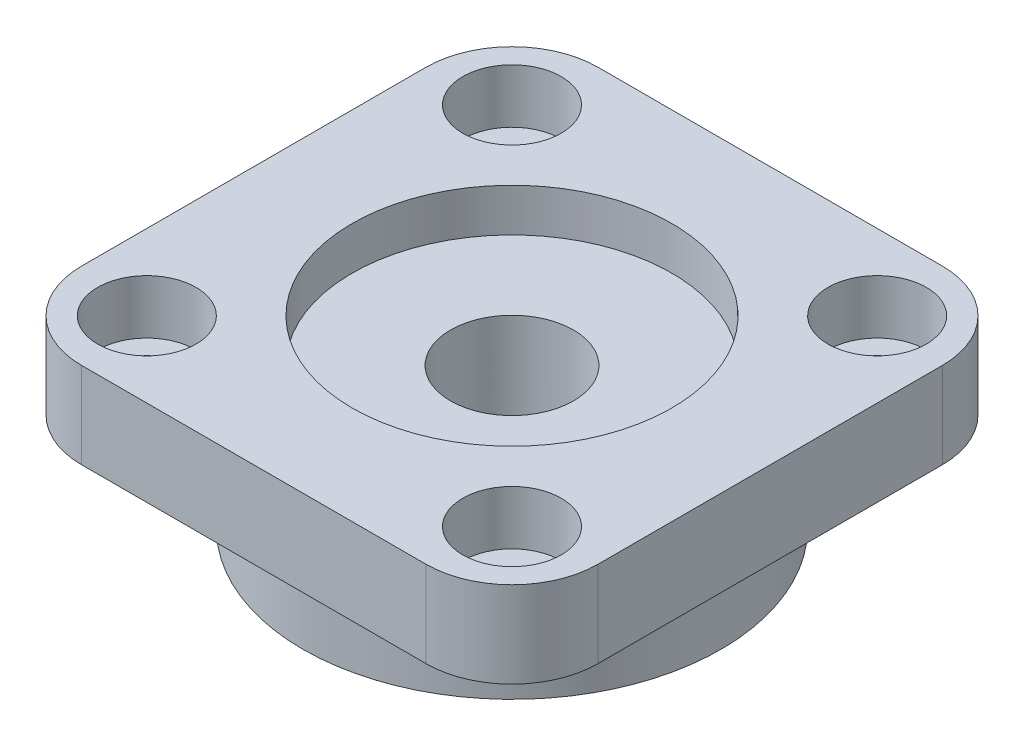
ISO-10303-21;
HEADER;
FILE_DESCRIPTION(('STEP AP214'),'2;1');
FILE_NAME('part.step','',(''),(''),'','','');
FILE_SCHEMA(('AUTOMOTIVE_DESIGN { 1 0 10303 214 1 1 1 1 }'));
ENDSEC;
DATA;
#1=APPLICATION_CONTEXT('core data for automotive mechanical design processes');
#2=APPLICATION_PROTOCOL_DEFINITION('international standard','automotive_design',2000,#1);
#3=PRODUCT_CONTEXT('',#1,'mechanical');
#4=PRODUCT('Part','Part','',(#3));
#5=PRODUCT_RELATED_PRODUCT_CATEGORY('part','',(#4));
#6=PRODUCT_DEFINITION_FORMATION('','',#4);
#7=PRODUCT_DEFINITION_CONTEXT('part definition',#1,'design');
#8=PRODUCT_DEFINITION('design','',#6,#7);
#9=PRODUCT_DEFINITION_SHAPE('','',#8);
#10=(LENGTH_UNIT() NAMED_UNIT(*) SI_UNIT(.MILLI.,.METRE.));
#11=(NAMED_UNIT(*) PLANE_ANGLE_UNIT() SI_UNIT($,.RADIAN.));
#12=(NAMED_UNIT(*) SI_UNIT($,.STERADIAN.) SOLID_ANGLE_UNIT());
#13=UNCERTAINTY_MEASURE_WITH_UNIT(LENGTH_MEASURE(1.E-05),#10,'distance_accuracy_value','');
#14=(GEOMETRIC_REPRESENTATION_CONTEXT(3) GLOBAL_UNCERTAINTY_ASSIGNED_CONTEXT((#13)) GLOBAL_UNIT_ASSIGNED_CONTEXT((#10,
#11,#12)) REPRESENTATION_CONTEXT('',''));
#15=CARTESIAN_POINT('',(0.,0.,0.));
#16=DIRECTION('',(0.,0.,1.));
#17=DIRECTION('',(1.,0.,0.));
#18=AXIS2_PLACEMENT_3D('',#15,#16,#17);
#19=CARTESIAN_POINT('',(0.,8.,0.));
#20=DIRECTION('',(0.,-1.,0.));
#21=DIRECTION('',(0.,0.,-1.));
#22=AXIS2_PLACEMENT_3D('',#19,#20,#21);
#23=CYLINDRICAL_SURFACE('',#22,5.);
#24=CARTESIAN_POINT('',(0.,3.5,0.));
#25=DIRECTION('',(0.,-1.,0.));
#26=DIRECTION('',(0.,0.,-1.));
#27=AXIS2_PLACEMENT_3D('',#24,#25,#26);
#28=CIRCLE('',#27,5.);
#29=CARTESIAN_POINT('',(0.,3.5,-5.));
#30=VERTEX_POINT('',#29);
#31=EDGE_CURVE('E187',#30,#30,#28,.T.);
#32=ORIENTED_EDGE('',*,*,#31,.T.);
#33=EDGE_LOOP('',(#32));
#34=FACE_BOUND('',#33,.T.);
#35=CARTESIAN_POINT('',(0.,11.5,0.));
#36=DIRECTION('',(0.,1.,0.));
#37=DIRECTION('',(0.,0.,1.));
#38=AXIS2_PLACEMENT_3D('',#35,#36,#37);
#39=CIRCLE('',#38,5.);
#40=CARTESIAN_POINT('',(0.,11.5,5.));
#41=VERTEX_POINT('',#40);
#42=EDGE_CURVE('E39',#41,#41,#39,.T.);
#43=ORIENTED_EDGE('',*,*,#42,.T.);
#44=EDGE_LOOP('',(#43));
#45=FACE_BOUND('',#44,.T.);
#46=ADVANCED_FACE('F35',(#34,#45),#23,.F.);
#47=CARTESIAN_POINT('',(0.,0.,0.));
#48=DIRECTION('',(0.,1.,0.));
#49=DIRECTION('',(0.,0.,1.));
#50=AXIS2_PLACEMENT_3D('',#47,#48,#49);
#51=PLANE('',#50);
#52=CARTESIAN_POINT('',(0.,0.,0.));
#53=DIRECTION('',(0.,-1.,0.));
#54=DIRECTION('',(0.,0.,-1.));
#55=AXIS2_PLACEMENT_3D('',#52,#53,#54);
#56=CIRCLE('',#55,13.);
#57=CARTESIAN_POINT('',(0.,0.,-13.));
#58=VERTEX_POINT('',#57);
#59=EDGE_CURVE('E197',#58,#58,#56,.T.);
#60=ORIENTED_EDGE('',*,*,#59,.F.);
#61=EDGE_LOOP('',(#60));
#62=FACE_BOUND('',#61,.T.);
#63=CARTESIAN_POINT('',(0.,0.,0.));
#64=DIRECTION('',(0.,1.,0.));
#65=DIRECTION('',(0.,0.,1.));
#66=AXIS2_PLACEMENT_3D('',#63,#64,#65);
#67=CIRCLE('',#66,17.);
#68=CARTESIAN_POINT('',(0.,0.,17.));
#69=VERTEX_POINT('',#68);
#70=EDGE_CURVE('E145',#69,#69,#67,.T.);
#71=ORIENTED_EDGE('',*,*,#70,.F.);
#72=EDGE_LOOP('',(#71));
#73=FACE_BOUND('',#72,.T.);
#74=ADVANCED_FACE('F264',(#62,#73),#51,.F.);
#75=CARTESIAN_POINT('',(0.,8.,0.));
#76=DIRECTION('',(0.,-1.,0.));
#77=DIRECTION('',(0.,0.,-1.));
#78=AXIS2_PLACEMENT_3D('',#75,#76,#77);
#79=CYLINDRICAL_SURFACE('',#78,17.);
#80=CARTESIAN_POINT('',(0.,8.,0.));
#81=DIRECTION('',(0.,1.,0.));
#82=DIRECTION('',(0.,0.,1.));
#83=AXIS2_PLACEMENT_3D('',#80,#81,#82);
#84=CIRCLE('',#83,17.);
#85=CARTESIAN_POINT('',(0.,8.,17.));
#86=VERTEX_POINT('',#85);
#87=EDGE_CURVE('E142',#86,#86,#84,.T.);
#88=ORIENTED_EDGE('',*,*,#87,.F.);
#89=EDGE_LOOP('',(#88));
#90=FACE_BOUND('',#89,.T.);
#91=ORIENTED_EDGE('',*,*,#70,.T.);
#92=EDGE_LOOP('',(#91));
#93=FACE_BOUND('',#92,.T.);
#94=ADVANCED_FACE('F269',(#90,#93),#79,.T.);
#95=CARTESIAN_POINT('',(0.,8.,0.));
#96=DIRECTION('',(0.,1.,0.));
#97=DIRECTION('',(0.,0.,1.));
#98=AXIS2_PLACEMENT_3D('',#95,#96,#97);
#99=PLANE('',#98);
#100=CARTESIAN_POINT('',(-14.8492424049175,8.,-14.8492424049167));
#101=DIRECTION('',(0.,1.,0.));
#102=DIRECTION('',(0.,0.,1.));
#103=AXIS2_PLACEMENT_3D('',#100,#101,#102);
#104=CIRCLE('',#103,2.25);
#105=CARTESIAN_POINT('',(-14.8492424049175,8.,-12.5992424049167));
#106=VERTEX_POINT('',#105);
#107=EDGE_CURVE('E183',#106,#106,#104,.T.);
#108=ORIENTED_EDGE('',*,*,#107,.T.);
#109=EDGE_LOOP('',(#108));
#110=FACE_BOUND('',#109,.T.);
#111=CARTESIAN_POINT('',(14.8492424049175,8.,-14.8492424049175));
#112=DIRECTION('',(0.,1.,0.));
#113=DIRECTION('',(0.,0.,1.));
#114=AXIS2_PLACEMENT_3D('',#111,#112,#113);
#115=CIRCLE('',#114,2.25);
#116=CARTESIAN_POINT('',(14.8492424049175,8.,-12.5992424049175));
#117=VERTEX_POINT('',#116);
#118=EDGE_CURVE('E178',#117,#117,#115,.T.);
#119=ORIENTED_EDGE('',*,*,#118,.T.);
#120=EDGE_LOOP('',(#119));
#121=FACE_BOUND('',#120,.T.);
#122=CARTESIAN_POINT('',(14.8492424049183,8.,14.8492424049175));
#123=DIRECTION('',(0.,1.,0.));
#124=DIRECTION('',(0.,0.,1.));
#125=AXIS2_PLACEMENT_3D('',#122,#123,#124);
#126=CIRCLE('',#125,2.25);
#127=CARTESIAN_POINT('',(14.8492424049183,8.,17.0992424049175));
#128=VERTEX_POINT('',#127);
#129=EDGE_CURVE('E173',#128,#128,#126,.T.);
#130=ORIENTED_EDGE('',*,*,#129,.T.);
#131=EDGE_LOOP('',(#130));
#132=FACE_BOUND('',#131,.T.);
#133=CARTESIAN_POINT('',(-14.8492424049167,8.,14.8492424049183));
#134=DIRECTION('',(0.,1.,0.));
#135=DIRECTION('',(0.,0.,1.));
#136=AXIS2_PLACEMENT_3D('',#133,#134,#135);
#137=CIRCLE('',#136,2.25);
#138=CARTESIAN_POINT('',(-14.8492424049167,8.,17.0992424049183));
#139=VERTEX_POINT('',#138);
#140=EDGE_CURVE('E136',#139,#139,#137,.T.);
#141=ORIENTED_EDGE('',*,*,#140,.T.);
#142=EDGE_LOOP('',(#141));
#143=FACE_BOUND('',#142,.T.);
#144=DIRECTION('',(1.,0.,0.));
#145=VECTOR('',#144,1.);
#146=CARTESIAN_POINT('',(21.,8.,21.));
#147=LINE('',#146,#145);
#148=CARTESIAN_POINT('',(-14.,8.,21.));
#149=VERTEX_POINT('',#148);
#150=CARTESIAN_POINT('',(14.,8.,21.));
#151=VERTEX_POINT('',#150);
#152=EDGE_CURVE('E120',#149,#151,#147,.T.);
#153=ORIENTED_EDGE('',*,*,#152,.F.);
#154=CARTESIAN_POINT('',(-14.,8.,14.));
#155=DIRECTION('',(0.,1.,0.));
#156=DIRECTION('',(0.,0.,1.));
#157=AXIS2_PLACEMENT_3D('',#154,#155,#156);
#158=CIRCLE('',#157,7.);
#159=CARTESIAN_POINT('',(-21.,8.,14.));
#160=VERTEX_POINT('',#159);
#161=EDGE_CURVE('E103',#149,#160,#158,.F.);
#162=ORIENTED_EDGE('',*,*,#161,.T.);
#163=DIRECTION('',(0.,0.,1.));
#164=VECTOR('',#163,1.);
#165=CARTESIAN_POINT('',(-21.,8.,21.));
#166=LINE('',#165,#164);
#167=CARTESIAN_POINT('',(-21.,8.,-14.));
#168=VERTEX_POINT('',#167);
#169=EDGE_CURVE('E131',#168,#160,#166,.T.);
#170=ORIENTED_EDGE('',*,*,#169,.F.);
#171=CARTESIAN_POINT('',(-14.,8.,-14.));
#172=DIRECTION('',(0.,1.,0.));
#173=DIRECTION('',(0.,0.,1.));
#174=AXIS2_PLACEMENT_3D('',#171,#172,#173);
#175=CIRCLE('',#174,7.);
#176=CARTESIAN_POINT('',(-14.,8.,-21.));
#177=VERTEX_POINT('',#176);
#178=EDGE_CURVE('E124',#168,#177,#175,.F.);
#179=ORIENTED_EDGE('',*,*,#178,.T.);
#180=DIRECTION('',(-1.,0.,0.));
#181=VECTOR('',#180,1.);
#182=CARTESIAN_POINT('',(21.,8.,-21.));
#183=LINE('',#182,#181);
#184=CARTESIAN_POINT('',(14.,8.,-21.));
#185=VERTEX_POINT('',#184);
#186=EDGE_CURVE('E134',#185,#177,#183,.T.);
#187=ORIENTED_EDGE('',*,*,#186,.F.);
#188=CARTESIAN_POINT('',(14.,8.,-14.));
#189=DIRECTION('',(0.,1.,0.));
#190=DIRECTION('',(0.,0.,1.));
#191=AXIS2_PLACEMENT_3D('',#188,#189,#190);
#192=CIRCLE('',#191,7.);
#193=CARTESIAN_POINT('',(21.,8.,-14.));
#194=VERTEX_POINT('',#193);
#195=EDGE_CURVE('E151',#185,#194,#192,.F.);
#196=ORIENTED_EDGE('',*,*,#195,.T.);
#197=DIRECTION('',(0.,0.,-1.));
#198=VECTOR('',#197,1.);
#199=CARTESIAN_POINT('',(21.,8.,21.));
#200=LINE('',#199,#198);
#201=CARTESIAN_POINT('',(21.,8.,14.));
#202=VERTEX_POINT('',#201);
#203=EDGE_CURVE('E130',#202,#194,#200,.T.);
#204=ORIENTED_EDGE('',*,*,#203,.F.);
#205=CARTESIAN_POINT('',(14.,8.,14.));
#206=DIRECTION('',(0.,1.,0.));
#207=DIRECTION('',(0.,0.,1.));
#208=AXIS2_PLACEMENT_3D('',#205,#206,#207);
#209=CIRCLE('',#208,7.);
#210=EDGE_CURVE('E114',#202,#151,#209,.F.);
#211=ORIENTED_EDGE('',*,*,#210,.T.);
#212=EDGE_LOOP('',(#153,#162,#170,#179,#187,#196,#204,#211));
#213=FACE_BOUND('',#212,.T.);
#214=ORIENTED_EDGE('',*,*,#87,.T.);
#215=EDGE_LOOP('',(#214));
#216=FACE_BOUND('',#215,.T.);
#217=ADVANCED_FACE('F127',(#110,#121,#132,#143,#213,#216),#99,.F.);
#218=CARTESIAN_POINT('',(0.,15.,0.));
#219=DIRECTION('',(0.,1.,0.));
#220=DIRECTION('',(0.,0.,1.));
#221=AXIS2_PLACEMENT_3D('',#218,#219,#220);
#222=PLANE('',#221);
#223=CARTESIAN_POINT('',(0.,15.,0.));
#224=DIRECTION('',(0.,1.,0.));
#225=DIRECTION('',(0.,0.,1.));
#226=AXIS2_PLACEMENT_3D('',#223,#224,#225);
#227=CIRCLE('',#226,13.);
#228=CARTESIAN_POINT('',(0.,15.,13.));
#229=VERTEX_POINT('',#228);
#230=EDGE_CURVE('E204',#229,#229,#227,.T.);
#231=ORIENTED_EDGE('',*,*,#230,.F.);
#232=EDGE_LOOP('',(#231));
#233=FACE_BOUND('',#232,.T.);
#234=CARTESIAN_POINT('',(-14.8492424049175,15.,-14.8492424049167));
#235=DIRECTION('',(0.,1.,0.));
#236=DIRECTION('',(0.,0.,1.));
#237=AXIS2_PLACEMENT_3D('',#234,#235,#236);
#238=CIRCLE('',#237,4.);
#239=CARTESIAN_POINT('',(-14.8492424049175,15.,-10.8492424049167));
#240=VERTEX_POINT('',#239);
#241=EDGE_CURVE('E189',#240,#240,#238,.T.);
#242=ORIENTED_EDGE('',*,*,#241,.F.);
#243=EDGE_LOOP('',(#242));
#244=FACE_BOUND('',#243,.T.);
#245=CARTESIAN_POINT('',(14.8492424049175,15.,-14.8492424049175));
#246=DIRECTION('',(0.,1.,0.));
#247=DIRECTION('',(0.,0.,1.));
#248=AXIS2_PLACEMENT_3D('',#245,#246,#247);
#249=CIRCLE('',#248,4.);
#250=CARTESIAN_POINT('',(14.8492424049175,15.,-10.8492424049175));
#251=VERTEX_POINT('',#250);
#252=EDGE_CURVE('E185',#251,#251,#249,.T.);
#253=ORIENTED_EDGE('',*,*,#252,.F.);
#254=EDGE_LOOP('',(#253));
#255=FACE_BOUND('',#254,.T.);
#256=CARTESIAN_POINT('',(14.8492424049183,15.,14.8492424049175));
#257=DIRECTION('',(0.,1.,0.));
#258=DIRECTION('',(0.,0.,1.));
#259=AXIS2_PLACEMENT_3D('',#256,#257,#258);
#260=CIRCLE('',#259,4.);
#261=CARTESIAN_POINT('',(14.8492424049183,15.,18.8492424049175));
#262=VERTEX_POINT('',#261);
#263=EDGE_CURVE('E181',#262,#262,#260,.T.);
#264=ORIENTED_EDGE('',*,*,#263,.F.);
#265=EDGE_LOOP('',(#264));
#266=FACE_BOUND('',#265,.T.);
#267=CARTESIAN_POINT('',(-14.8492424049167,15.,14.8492424049183));
#268=DIRECTION('',(0.,1.,0.));
#269=DIRECTION('',(0.,0.,1.));
#270=AXIS2_PLACEMENT_3D('',#267,#268,#269);
#271=CIRCLE('',#270,4.);
#272=CARTESIAN_POINT('',(-14.8492424049167,15.,18.8492424049183));
#273=VERTEX_POINT('',#272);
#274=EDGE_CURVE('E176',#273,#273,#271,.T.);
#275=ORIENTED_EDGE('',*,*,#274,.F.);
#276=EDGE_LOOP('',(#275));
#277=FACE_BOUND('',#276,.T.);
#278=DIRECTION('',(0.,0.,1.));
#279=VECTOR('',#278,1.);
#280=CARTESIAN_POINT('',(-21.,15.,21.));
#281=LINE('',#280,#279);
#282=CARTESIAN_POINT('',(-21.,15.,-14.));
#283=VERTEX_POINT('',#282);
#284=CARTESIAN_POINT('',(-21.,15.,14.));
#285=VERTEX_POINT('',#284);
#286=EDGE_CURVE('E141',#283,#285,#281,.T.);
#287=ORIENTED_EDGE('',*,*,#286,.T.);
#288=CARTESIAN_POINT('',(-14.,15.,14.));
#289=DIRECTION('',(0.,1.,0.));
#290=DIRECTION('',(0.,0.,1.));
#291=AXIS2_PLACEMENT_3D('',#288,#289,#290);
#292=CIRCLE('',#291,7.);
#293=CARTESIAN_POINT('',(-14.,15.,21.));
#294=VERTEX_POINT('',#293);
#295=EDGE_CURVE('E162',#285,#294,#292,.T.);
#296=ORIENTED_EDGE('',*,*,#295,.T.);
#297=DIRECTION('',(1.,0.,0.));
#298=VECTOR('',#297,1.);
#299=CARTESIAN_POINT('',(21.,15.,21.));
#300=LINE('',#299,#298);
#301=CARTESIAN_POINT('',(14.,15.,21.));
#302=VERTEX_POINT('',#301);
#303=EDGE_CURVE('E123',#294,#302,#300,.T.);
#304=ORIENTED_EDGE('',*,*,#303,.T.);
#305=CARTESIAN_POINT('',(14.,15.,14.));
#306=DIRECTION('',(0.,1.,0.));
#307=DIRECTION('',(0.,0.,1.));
#308=AXIS2_PLACEMENT_3D('',#305,#306,#307);
#309=CIRCLE('',#308,7.);
#310=CARTESIAN_POINT('',(21.,15.,14.));
#311=VERTEX_POINT('',#310);
#312=EDGE_CURVE('E160',#302,#311,#309,.T.);
#313=ORIENTED_EDGE('',*,*,#312,.T.);
#314=DIRECTION('',(0.,0.,-1.));
#315=VECTOR('',#314,1.);
#316=CARTESIAN_POINT('',(21.,15.,21.));
#317=LINE('',#316,#315);
#318=CARTESIAN_POINT('',(21.,15.,-14.));
#319=VERTEX_POINT('',#318);
#320=EDGE_CURVE('E235',#311,#319,#317,.T.);
#321=ORIENTED_EDGE('',*,*,#320,.T.);
#322=CARTESIAN_POINT('',(14.,15.,-14.));
#323=DIRECTION('',(0.,1.,0.));
#324=DIRECTION('',(0.,0.,1.));
#325=AXIS2_PLACEMENT_3D('',#322,#323,#324);
#326=CIRCLE('',#325,7.);
#327=CARTESIAN_POINT('',(14.,15.,-21.));
#328=VERTEX_POINT('',#327);
#329=EDGE_CURVE('E58',#319,#328,#326,.T.);
#330=ORIENTED_EDGE('',*,*,#329,.T.);
#331=DIRECTION('',(-1.,0.,0.));
#332=VECTOR('',#331,1.);
#333=CARTESIAN_POINT('',(21.,15.,-21.));
#334=LINE('',#333,#332);
#335=CARTESIAN_POINT('',(-14.,15.,-21.));
#336=VERTEX_POINT('',#335);
#337=EDGE_CURVE('E148',#328,#336,#334,.T.);
#338=ORIENTED_EDGE('',*,*,#337,.T.);
#339=CARTESIAN_POINT('',(-14.,15.,-14.));
#340=DIRECTION('',(0.,1.,0.));
#341=DIRECTION('',(0.,0.,1.));
#342=AXIS2_PLACEMENT_3D('',#339,#340,#341);
#343=CIRCLE('',#342,7.);
#344=EDGE_CURVE('E157',#336,#283,#343,.T.);
#345=ORIENTED_EDGE('',*,*,#344,.T.);
#346=EDGE_LOOP('',(#287,#296,#304,#313,#321,#330,#338,#345));
#347=FACE_BOUND('',#346,.T.);
#348=ADVANCED_FACE('F237',(#233,#244,#255,#266,#277,#347),#222,.T.);
#349=CARTESIAN_POINT('',(-21.,15.,21.));
#350=DIRECTION('',(1.,0.,0.));
#351=DIRECTION('',(0.,0.,-1.));
#352=AXIS2_PLACEMENT_3D('',#349,#350,#351);
#353=PLANE('',#352);
#354=ORIENTED_EDGE('',*,*,#169,.T.);
#355=DIRECTION('',(0.,-1.,0.));
#356=VECTOR('',#355,1.);
#357=CARTESIAN_POINT('',(-21.,15.,14.));
#358=LINE('',#357,#356);
#359=EDGE_CURVE('E108',#160,#285,#358,.F.);
#360=ORIENTED_EDGE('',*,*,#359,.T.);
#361=ORIENTED_EDGE('',*,*,#286,.F.);
#362=DIRECTION('',(0.,-1.,0.));
#363=VECTOR('',#362,1.);
#364=CARTESIAN_POINT('',(-21.,15.,-14.));
#365=LINE('',#364,#363);
#366=EDGE_CURVE('E113',#283,#168,#365,.T.);
#367=ORIENTED_EDGE('',*,*,#366,.T.);
#368=EDGE_LOOP('',(#354,#360,#361,#367));
#369=FACE_BOUND('',#368,.T.);
#370=ADVANCED_FACE('F243',(#369),#353,.F.);
#371=CARTESIAN_POINT('',(21.,15.,21.));
#372=DIRECTION('',(0.,0.,-1.));
#373=DIRECTION('',(-1.,0.,0.));
#374=AXIS2_PLACEMENT_3D('',#371,#372,#373);
#375=PLANE('',#374);
#376=ORIENTED_EDGE('',*,*,#303,.F.);
#377=DIRECTION('',(0.,-1.,0.));
#378=VECTOR('',#377,1.);
#379=CARTESIAN_POINT('',(-14.,15.,21.));
#380=LINE('',#379,#378);
#381=EDGE_CURVE('E107',#294,#149,#380,.T.);
#382=ORIENTED_EDGE('',*,*,#381,.T.);
#383=ORIENTED_EDGE('',*,*,#152,.T.);
#384=DIRECTION('',(0.,-1.,0.));
#385=VECTOR('',#384,1.);
#386=CARTESIAN_POINT('',(14.,15.,21.));
#387=LINE('',#386,#385);
#388=EDGE_CURVE('E125',#151,#302,#387,.F.);
#389=ORIENTED_EDGE('',*,*,#388,.T.);
#390=EDGE_LOOP('',(#376,#382,#383,#389));
#391=FACE_BOUND('',#390,.T.);
#392=ADVANCED_FACE('F119',(#391),#375,.F.);
#393=CARTESIAN_POINT('',(21.,15.,21.));
#394=DIRECTION('',(-1.,0.,0.));
#395=DIRECTION('',(0.,0.,1.));
#396=AXIS2_PLACEMENT_3D('',#393,#394,#395);
#397=PLANE('',#396);
#398=ORIENTED_EDGE('',*,*,#320,.F.);
#399=DIRECTION('',(0.,-1.,0.));
#400=VECTOR('',#399,1.);
#401=CARTESIAN_POINT('',(21.,15.,14.));
#402=LINE('',#401,#400);
#403=EDGE_CURVE('E166',#311,#202,#402,.T.);
#404=ORIENTED_EDGE('',*,*,#403,.T.);
#405=ORIENTED_EDGE('',*,*,#203,.T.);
#406=DIRECTION('',(0.,-1.,0.));
#407=VECTOR('',#406,1.);
#408=CARTESIAN_POINT('',(21.,15.,-14.));
#409=LINE('',#408,#407);
#410=EDGE_CURVE('E164',#194,#319,#409,.F.);
#411=ORIENTED_EDGE('',*,*,#410,.T.);
#412=EDGE_LOOP('',(#398,#404,#405,#411));
#413=FACE_BOUND('',#412,.T.);
#414=ADVANCED_FACE('F251',(#413),#397,.F.);
#415=CARTESIAN_POINT('',(21.,15.,-21.));
#416=DIRECTION('',(0.,0.,1.));
#417=DIRECTION('',(1.,0.,0.));
#418=AXIS2_PLACEMENT_3D('',#415,#416,#417);
#419=PLANE('',#418);
#420=ORIENTED_EDGE('',*,*,#337,.F.);
#421=DIRECTION('',(0.,-1.,0.));
#422=VECTOR('',#421,1.);
#423=CARTESIAN_POINT('',(14.,15.,-21.));
#424=LINE('',#423,#422);
#425=EDGE_CURVE('E11',#328,#185,#424,.T.);
#426=ORIENTED_EDGE('',*,*,#425,.T.);
#427=ORIENTED_EDGE('',*,*,#186,.T.);
#428=DIRECTION('',(0.,-1.,0.));
#429=VECTOR('',#428,1.);
#430=CARTESIAN_POINT('',(-14.,15.,-21.));
#431=LINE('',#430,#429);
#432=EDGE_CURVE('E44',#177,#336,#431,.F.);
#433=ORIENTED_EDGE('',*,*,#432,.T.);
#434=EDGE_LOOP('',(#420,#426,#427,#433));
#435=FACE_BOUND('',#434,.T.);
#436=ADVANCED_FACE('F245',(#435),#419,.F.);
#437=CARTESIAN_POINT('',(-14.,15.,14.));
#438=DIRECTION('',(0.,-1.,0.));
#439=DIRECTION('',(0.,0.,-1.));
#440=AXIS2_PLACEMENT_3D('',#437,#438,#439);
#441=CYLINDRICAL_SURFACE('',#440,7.);
#442=ORIENTED_EDGE('',*,*,#295,.F.);
#443=ORIENTED_EDGE('',*,*,#359,.F.);
#444=ORIENTED_EDGE('',*,*,#161,.F.);
#445=ORIENTED_EDGE('',*,*,#381,.F.);
#446=EDGE_LOOP('',(#442,#443,#444,#445));
#447=FACE_BOUND('',#446,.T.);
#448=ADVANCED_FACE('F106',(#447),#441,.T.);
#449=CARTESIAN_POINT('',(14.,15.,14.));
#450=DIRECTION('',(0.,-1.,0.));
#451=DIRECTION('',(0.,0.,-1.));
#452=AXIS2_PLACEMENT_3D('',#449,#450,#451);
#453=CYLINDRICAL_SURFACE('',#452,7.);
#454=ORIENTED_EDGE('',*,*,#312,.F.);
#455=ORIENTED_EDGE('',*,*,#388,.F.);
#456=ORIENTED_EDGE('',*,*,#210,.F.);
#457=ORIENTED_EDGE('',*,*,#403,.F.);
#458=EDGE_LOOP('',(#454,#455,#456,#457));
#459=FACE_BOUND('',#458,.T.);
#460=ADVANCED_FACE('F255',(#459),#453,.T.);
#461=CARTESIAN_POINT('',(14.,15.,-14.));
#462=DIRECTION('',(0.,-1.,0.));
#463=DIRECTION('',(0.,0.,-1.));
#464=AXIS2_PLACEMENT_3D('',#461,#462,#463);
#465=CYLINDRICAL_SURFACE('',#464,7.);
#466=ORIENTED_EDGE('',*,*,#329,.F.);
#467=ORIENTED_EDGE('',*,*,#410,.F.);
#468=ORIENTED_EDGE('',*,*,#195,.F.);
#469=ORIENTED_EDGE('',*,*,#425,.F.);
#470=EDGE_LOOP('',(#466,#467,#468,#469));
#471=FACE_BOUND('',#470,.T.);
#472=ADVANCED_FACE('F247',(#471),#465,.T.);
#473=CARTESIAN_POINT('',(-14.,15.,-14.));
#474=DIRECTION('',(0.,-1.,0.));
#475=DIRECTION('',(0.,0.,-1.));
#476=AXIS2_PLACEMENT_3D('',#473,#474,#475);
#477=CYLINDRICAL_SURFACE('',#476,7.);
#478=ORIENTED_EDGE('',*,*,#344,.F.);
#479=ORIENTED_EDGE('',*,*,#432,.F.);
#480=ORIENTED_EDGE('',*,*,#178,.F.);
#481=ORIENTED_EDGE('',*,*,#366,.F.);
#482=EDGE_LOOP('',(#478,#479,#480,#481));
#483=FACE_BOUND('',#482,.T.);
#484=ADVANCED_FACE('F37',(#483),#477,.T.);
#485=CARTESIAN_POINT('',(-14.8492424049167,15.,14.8492424049183));
#486=DIRECTION('',(0.,1.,0.));
#487=DIRECTION('',(0.,0.,1.));
#488=AXIS2_PLACEMENT_3D('',#485,#486,#487);
#489=CYLINDRICAL_SURFACE('',#488,2.25);
#490=CARTESIAN_POINT('',(-14.8492424049167,10.6,14.8492424049183));
#491=DIRECTION('',(0.,1.,0.));
#492=DIRECTION('',(0.,0.,1.));
#493=AXIS2_PLACEMENT_3D('',#490,#491,#492);
#494=CIRCLE('',#493,2.25);
#495=CARTESIAN_POINT('',(-14.8492424049167,10.6,17.0992424049183));
#496=VERTEX_POINT('',#495);
#497=EDGE_CURVE('E172',#496,#496,#494,.T.);
#498=ORIENTED_EDGE('',*,*,#497,.T.);
#499=EDGE_LOOP('',(#498));
#500=FACE_BOUND('',#499,.T.);
#501=ORIENTED_EDGE('',*,*,#140,.F.);
#502=EDGE_LOOP('',(#501));
#503=FACE_BOUND('',#502,.T.);
#504=ADVANCED_FACE('F389',(#500,#503),#489,.F.);
#505=CARTESIAN_POINT('',(-12.5992424049167,10.6,14.8492424049183));
#506=DIRECTION('',(0.,-1.,0.));
#507=DIRECTION('',(0.,0.,-1.));
#508=AXIS2_PLACEMENT_3D('',#505,#506,#507);
#509=PLANE('',#508);
#510=ORIENTED_EDGE('',*,*,#497,.F.);
#511=EDGE_LOOP('',(#510));
#512=FACE_BOUND('',#511,.T.);
#513=CARTESIAN_POINT('',(-14.8492424049167,10.6,14.8492424049183));
#514=DIRECTION('',(0.,1.,0.));
#515=DIRECTION('',(0.,0.,1.));
#516=AXIS2_PLACEMENT_3D('',#513,#514,#515);
#517=CIRCLE('',#516,4.);
#518=CARTESIAN_POINT('',(-14.8492424049167,10.6,18.8492424049183));
#519=VERTEX_POINT('',#518);
#520=EDGE_CURVE('E227',#519,#519,#517,.T.);
#521=ORIENTED_EDGE('',*,*,#520,.T.);
#522=EDGE_LOOP('',(#521));
#523=FACE_BOUND('',#522,.T.);
#524=ADVANCED_FACE('F386',(#512,#523),#509,.F.);
#525=CARTESIAN_POINT('',(-14.8492424049167,15.,14.8492424049183));
#526=DIRECTION('',(0.,1.,0.));
#527=DIRECTION('',(0.,0.,1.));
#528=AXIS2_PLACEMENT_3D('',#525,#526,#527);
#529=CYLINDRICAL_SURFACE('',#528,4.);
#530=ORIENTED_EDGE('',*,*,#520,.F.);
#531=EDGE_LOOP('',(#530));
#532=FACE_BOUND('',#531,.T.);
#533=ORIENTED_EDGE('',*,*,#274,.T.);
#534=EDGE_LOOP('',(#533));
#535=FACE_BOUND('',#534,.T.);
#536=ADVANCED_FACE('F382',(#532,#535),#529,.F.);
#537=CARTESIAN_POINT('',(14.8492424049183,15.,14.8492424049175));
#538=DIRECTION('',(0.,1.,0.));
#539=DIRECTION('',(0.,0.,1.));
#540=AXIS2_PLACEMENT_3D('',#537,#538,#539);
#541=CYLINDRICAL_SURFACE('',#540,2.25);
#542=CARTESIAN_POINT('',(14.8492424049183,10.6,14.8492424049175));
#543=DIRECTION('',(0.,1.,0.));
#544=DIRECTION('',(0.,0.,1.));
#545=AXIS2_PLACEMENT_3D('',#542,#543,#544);
#546=CIRCLE('',#545,2.25);
#547=CARTESIAN_POINT('',(14.8492424049183,10.6,17.0992424049175));
#548=VERTEX_POINT('',#547);
#549=EDGE_CURVE('E177',#548,#548,#546,.T.);
#550=ORIENTED_EDGE('',*,*,#549,.T.);
#551=EDGE_LOOP('',(#550));
#552=FACE_BOUND('',#551,.T.);
#553=ORIENTED_EDGE('',*,*,#129,.F.);
#554=EDGE_LOOP('',(#553));
#555=FACE_BOUND('',#554,.T.);
#556=ADVANCED_FACE('F378',(#552,#555),#541,.F.);
#557=CARTESIAN_POINT('',(17.0992424049183,10.6,14.8492424049175));
#558=DIRECTION('',(0.,-1.,0.));
#559=DIRECTION('',(0.,0.,-1.));
#560=AXIS2_PLACEMENT_3D('',#557,#558,#559);
#561=PLANE('',#560);
#562=ORIENTED_EDGE('',*,*,#549,.F.);
#563=EDGE_LOOP('',(#562));
#564=FACE_BOUND('',#563,.T.);
#565=CARTESIAN_POINT('',(14.8492424049183,10.6,14.8492424049175));
#566=DIRECTION('',(0.,1.,0.));
#567=DIRECTION('',(0.,0.,1.));
#568=AXIS2_PLACEMENT_3D('',#565,#566,#567);
#569=CIRCLE('',#568,4.);
#570=CARTESIAN_POINT('',(14.8492424049183,10.6,18.8492424049175));
#571=VERTEX_POINT('',#570);
#572=EDGE_CURVE('E220',#571,#571,#569,.T.);
#573=ORIENTED_EDGE('',*,*,#572,.T.);
#574=EDGE_LOOP('',(#573));
#575=FACE_BOUND('',#574,.T.);
#576=ADVANCED_FACE('F374',(#564,#575),#561,.F.);
#577=CARTESIAN_POINT('',(14.8492424049183,15.,14.8492424049175));
#578=DIRECTION('',(0.,1.,0.));
#579=DIRECTION('',(0.,0.,1.));
#580=AXIS2_PLACEMENT_3D('',#577,#578,#579);
#581=CYLINDRICAL_SURFACE('',#580,4.);
#582=ORIENTED_EDGE('',*,*,#572,.F.);
#583=EDGE_LOOP('',(#582));
#584=FACE_BOUND('',#583,.T.);
#585=ORIENTED_EDGE('',*,*,#263,.T.);
#586=EDGE_LOOP('',(#585));
#587=FACE_BOUND('',#586,.T.);
#588=ADVANCED_FACE('F370',(#584,#587),#581,.F.);
#589=CARTESIAN_POINT('',(14.8492424049175,15.,-14.8492424049175));
#590=DIRECTION('',(0.,1.,0.));
#591=DIRECTION('',(0.,0.,1.));
#592=AXIS2_PLACEMENT_3D('',#589,#590,#591);
#593=CYLINDRICAL_SURFACE('',#592,2.25);
#594=CARTESIAN_POINT('',(14.8492424049175,10.6,-14.8492424049175));
#595=DIRECTION('',(0.,1.,0.));
#596=DIRECTION('',(0.,0.,1.));
#597=AXIS2_PLACEMENT_3D('',#594,#595,#596);
#598=CIRCLE('',#597,2.25);
#599=CARTESIAN_POINT('',(14.8492424049175,10.6,-12.5992424049175));
#600=VERTEX_POINT('',#599);
#601=EDGE_CURVE('E182',#600,#600,#598,.T.);
#602=ORIENTED_EDGE('',*,*,#601,.T.);
#603=EDGE_LOOP('',(#602));
#604=FACE_BOUND('',#603,.T.);
#605=ORIENTED_EDGE('',*,*,#118,.F.);
#606=EDGE_LOOP('',(#605));
#607=FACE_BOUND('',#606,.T.);
#608=ADVANCED_FACE('F366',(#604,#607),#593,.F.);
#609=CARTESIAN_POINT('',(17.0992424049175,10.6,-14.8492424049175));
#610=DIRECTION('',(0.,-1.,0.));
#611=DIRECTION('',(0.,0.,-1.));
#612=AXIS2_PLACEMENT_3D('',#609,#610,#611);
#613=PLANE('',#612);
#614=ORIENTED_EDGE('',*,*,#601,.F.);
#615=EDGE_LOOP('',(#614));
#616=FACE_BOUND('',#615,.T.);
#617=CARTESIAN_POINT('',(14.8492424049175,10.6,-14.8492424049175));
#618=DIRECTION('',(0.,1.,0.));
#619=DIRECTION('',(0.,0.,1.));
#620=AXIS2_PLACEMENT_3D('',#617,#618,#619);
#621=CIRCLE('',#620,4.);
#622=CARTESIAN_POINT('',(14.8492424049175,10.6,-10.8492424049175));
#623=VERTEX_POINT('',#622);
#624=EDGE_CURVE('E213',#623,#623,#621,.T.);
#625=ORIENTED_EDGE('',*,*,#624,.T.);
#626=EDGE_LOOP('',(#625));
#627=FACE_BOUND('',#626,.T.);
#628=ADVANCED_FACE('F362',(#616,#627),#613,.F.);
#629=CARTESIAN_POINT('',(14.8492424049175,15.,-14.8492424049175));
#630=DIRECTION('',(0.,1.,0.));
#631=DIRECTION('',(0.,0.,1.));
#632=AXIS2_PLACEMENT_3D('',#629,#630,#631);
#633=CYLINDRICAL_SURFACE('',#632,4.);
#634=ORIENTED_EDGE('',*,*,#624,.F.);
#635=EDGE_LOOP('',(#634));
#636=FACE_BOUND('',#635,.T.);
#637=ORIENTED_EDGE('',*,*,#252,.T.);
#638=EDGE_LOOP('',(#637));
#639=FACE_BOUND('',#638,.T.);
#640=ADVANCED_FACE('F358',(#636,#639),#633,.F.);
#641=CARTESIAN_POINT('',(-14.8492424049175,15.,-14.8492424049167));
#642=DIRECTION('',(0.,1.,0.));
#643=DIRECTION('',(0.,0.,1.));
#644=AXIS2_PLACEMENT_3D('',#641,#642,#643);
#645=CYLINDRICAL_SURFACE('',#644,2.25);
#646=CARTESIAN_POINT('',(-14.8492424049175,10.6,-14.8492424049167));
#647=DIRECTION('',(0.,1.,0.));
#648=DIRECTION('',(0.,0.,1.));
#649=AXIS2_PLACEMENT_3D('',#646,#647,#648);
#650=CIRCLE('',#649,2.25);
#651=CARTESIAN_POINT('',(-14.8492424049175,10.6,-12.5992424049167));
#652=VERTEX_POINT('',#651);
#653=EDGE_CURVE('E186',#652,#652,#650,.T.);
#654=ORIENTED_EDGE('',*,*,#653,.T.);
#655=EDGE_LOOP('',(#654));
#656=FACE_BOUND('',#655,.T.);
#657=ORIENTED_EDGE('',*,*,#107,.F.);
#658=EDGE_LOOP('',(#657));
#659=FACE_BOUND('',#658,.T.);
#660=ADVANCED_FACE('F354',(#656,#659),#645,.F.);
#661=CARTESIAN_POINT('',(-12.5992424049175,10.6,-14.8492424049167));
#662=DIRECTION('',(0.,-1.,0.));
#663=DIRECTION('',(0.,0.,-1.));
#664=AXIS2_PLACEMENT_3D('',#661,#662,#663);
#665=PLANE('',#664);
#666=ORIENTED_EDGE('',*,*,#653,.F.);
#667=EDGE_LOOP('',(#666));
#668=FACE_BOUND('',#667,.T.);
#669=CARTESIAN_POINT('',(-14.8492424049175,10.6,-14.8492424049167));
#670=DIRECTION('',(0.,1.,0.));
#671=DIRECTION('',(0.,0.,1.));
#672=AXIS2_PLACEMENT_3D('',#669,#670,#671);
#673=CIRCLE('',#672,4.);
#674=CARTESIAN_POINT('',(-14.8492424049175,10.6,-10.8492424049167));
#675=VERTEX_POINT('',#674);
#676=EDGE_CURVE('E194',#675,#675,#673,.T.);
#677=ORIENTED_EDGE('',*,*,#676,.T.);
#678=EDGE_LOOP('',(#677));
#679=FACE_BOUND('',#678,.T.);
#680=ADVANCED_FACE('F350',(#668,#679),#665,.F.);
#681=CARTESIAN_POINT('',(-14.8492424049175,15.,-14.8492424049167));
#682=DIRECTION('',(0.,1.,0.));
#683=DIRECTION('',(0.,0.,1.));
#684=AXIS2_PLACEMENT_3D('',#681,#682,#683);
#685=CYLINDRICAL_SURFACE('',#684,4.);
#686=ORIENTED_EDGE('',*,*,#676,.F.);
#687=EDGE_LOOP('',(#686));
#688=FACE_BOUND('',#687,.T.);
#689=ORIENTED_EDGE('',*,*,#241,.T.);
#690=EDGE_LOOP('',(#689));
#691=FACE_BOUND('',#690,.T.);
#692=ADVANCED_FACE('F346',(#688,#691),#685,.F.);
#693=CARTESIAN_POINT('',(0.,3.5,0.));
#694=DIRECTION('',(0.,-1.,0.));
#695=DIRECTION('',(0.,0.,-1.));
#696=AXIS2_PLACEMENT_3D('',#693,#694,#695);
#697=CYLINDRICAL_SURFACE('',#696,13.);
#698=CARTESIAN_POINT('',(0.,3.5,0.));
#699=DIRECTION('',(0.,-1.,0.));
#700=DIRECTION('',(0.,0.,-1.));
#701=AXIS2_PLACEMENT_3D('',#698,#699,#700);
#702=CIRCLE('',#701,13.);
#703=CARTESIAN_POINT('',(0.,3.5,-13.));
#704=VERTEX_POINT('',#703);
#705=EDGE_CURVE('E190',#704,#704,#702,.T.);
#706=ORIENTED_EDGE('',*,*,#705,.F.);
#707=EDGE_LOOP('',(#706));
#708=FACE_BOUND('',#707,.T.);
#709=ORIENTED_EDGE('',*,*,#59,.T.);
#710=EDGE_LOOP('',(#709));
#711=FACE_BOUND('',#710,.T.);
#712=ADVANCED_FACE('F342',(#708,#711),#697,.F.);
#713=CARTESIAN_POINT('',(0.,3.5,0.));
#714=DIRECTION('',(0.,-1.,0.));
#715=DIRECTION('',(0.,0.,-1.));
#716=AXIS2_PLACEMENT_3D('',#713,#714,#715);
#717=PLANE('',#716);
#718=ORIENTED_EDGE('',*,*,#31,.F.);
#719=EDGE_LOOP('',(#718));
#720=FACE_BOUND('',#719,.T.);
#721=ORIENTED_EDGE('',*,*,#705,.T.);
#722=EDGE_LOOP('',(#721));
#723=FACE_BOUND('',#722,.T.);
#724=ADVANCED_FACE('F323',(#720,#723),#717,.T.);
#725=CARTESIAN_POINT('',(0.,11.5,0.));
#726=DIRECTION('',(0.,1.,0.));
#727=DIRECTION('',(0.,0.,1.));
#728=AXIS2_PLACEMENT_3D('',#725,#726,#727);
#729=CYLINDRICAL_SURFACE('',#728,13.);
#730=CARTESIAN_POINT('',(0.,11.5,0.));
#731=DIRECTION('',(0.,1.,0.));
#732=DIRECTION('',(0.,0.,1.));
#733=AXIS2_PLACEMENT_3D('',#730,#731,#732);
#734=CIRCLE('',#733,13.);
#735=CARTESIAN_POINT('',(0.,11.5,13.));
#736=VERTEX_POINT('',#735);
#737=EDGE_CURVE('E574',#736,#736,#734,.T.);
#738=ORIENTED_EDGE('',*,*,#737,.F.);
#739=EDGE_LOOP('',(#738));
#740=FACE_BOUND('',#739,.T.);
#741=ORIENTED_EDGE('',*,*,#230,.T.);
#742=EDGE_LOOP('',(#741));
#743=FACE_BOUND('',#742,.T.);
#744=ADVANCED_FACE('F317',(#740,#743),#729,.F.);
#745=CARTESIAN_POINT('',(0.,11.5,0.));
#746=DIRECTION('',(0.,1.,0.));
#747=DIRECTION('',(0.,0.,1.));
#748=AXIS2_PLACEMENT_3D('',#745,#746,#747);
#749=PLANE('',#748);
#750=ORIENTED_EDGE('',*,*,#42,.F.);
#751=EDGE_LOOP('',(#750));
#752=FACE_BOUND('',#751,.T.);
#753=ORIENTED_EDGE('',*,*,#737,.T.);
#754=EDGE_LOOP('',(#753));
#755=FACE_BOUND('',#754,.T.);
#756=ADVANCED_FACE('F322',(#752,#755),#749,.T.);
#757=CLOSED_SHELL('',(#46,#74,#94,#217,#348,#370,#392,#414,#436,#448,#460,#472,#484,#504,#524,
#536,#556,#576,#588,#608,#628,#640,#660,#680,#692,#712,#724,#744,#756));
#758=MANIFOLD_SOLID_BREP('B2',#757);
#759=ADVANCED_BREP_SHAPE_REPRESENTATION('',(#18,#758),#14);
#760=SHAPE_DEFINITION_REPRESENTATION(#9,#759);
ENDSEC;
END-ISO-10303-21;
